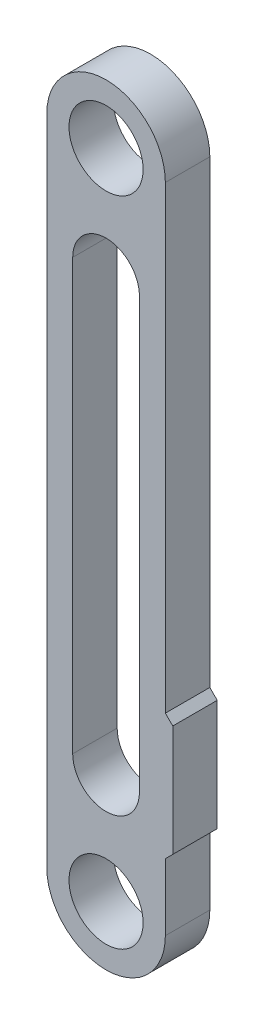
ISO-10303-21;
HEADER;
FILE_DESCRIPTION(('STEP AP214'),'2;1');
FILE_NAME('part.step','',(''),(''),'','','');
FILE_SCHEMA(('AUTOMOTIVE_DESIGN { 1 0 10303 214 1 1 1 1 }'));
ENDSEC;
DATA;
#1=APPLICATION_CONTEXT('core data for automotive mechanical design processes');
#2=APPLICATION_PROTOCOL_DEFINITION('international standard','automotive_design',2000,#1);
#3=PRODUCT_CONTEXT('',#1,'mechanical');
#4=PRODUCT('Part','Part','',(#3));
#5=PRODUCT_RELATED_PRODUCT_CATEGORY('part','',(#4));
#6=PRODUCT_DEFINITION_FORMATION('','',#4);
#7=PRODUCT_DEFINITION_CONTEXT('part definition',#1,'design');
#8=PRODUCT_DEFINITION('design','',#6,#7);
#9=PRODUCT_DEFINITION_SHAPE('','',#8);
#10=(LENGTH_UNIT() NAMED_UNIT(*) SI_UNIT(.MILLI.,.METRE.));
#11=(NAMED_UNIT(*) PLANE_ANGLE_UNIT() SI_UNIT($,.RADIAN.));
#12=(NAMED_UNIT(*) SI_UNIT($,.STERADIAN.) SOLID_ANGLE_UNIT());
#13=UNCERTAINTY_MEASURE_WITH_UNIT(LENGTH_MEASURE(1.E-05),#10,'distance_accuracy_value','');
#14=(GEOMETRIC_REPRESENTATION_CONTEXT(3) GLOBAL_UNCERTAINTY_ASSIGNED_CONTEXT((#13)) GLOBAL_UNIT_ASSIGNED_CONTEXT((#10,
#11,#12)) REPRESENTATION_CONTEXT('',''));
#15=CARTESIAN_POINT('',(0.,0.,0.));
#16=DIRECTION('',(0.,0.,1.));
#17=DIRECTION('',(1.,0.,0.));
#18=AXIS2_PLACEMENT_3D('',#15,#16,#17);
#19=CARTESIAN_POINT('',(8.,0.,6.));
#20=DIRECTION('',(-1.,0.,0.));
#21=DIRECTION('',(0.,0.,1.));
#22=AXIS2_PLACEMENT_3D('',#19,#20,#21);
#23=PLANE('',#22);
#24=DIRECTION('',(0.,1.,0.));
#25=VECTOR('',#24,1.);
#26=CARTESIAN_POINT('',(8.,0.,0.));
#27=LINE('',#26,#25);
#28=CARTESIAN_POINT('',(8.,0.,0.));
#29=VERTEX_POINT('',#28);
#30=CARTESIAN_POINT('',(8.,8.99999999999999,0.));
#31=VERTEX_POINT('',#30);
#32=EDGE_CURVE('E204',#29,#31,#27,.T.);
#33=ORIENTED_EDGE('',*,*,#32,.T.);
#34=DIRECTION('',(0.,0.,1.));
#35=VECTOR('',#34,1.);
#36=CARTESIAN_POINT('',(8.,8.99999999999999,6.));
#37=LINE('',#36,#35);
#38=CARTESIAN_POINT('',(8.,8.99999999999999,6.));
#39=VERTEX_POINT('',#38);
#40=EDGE_CURVE('E221',#31,#39,#37,.T.);
#41=ORIENTED_EDGE('',*,*,#40,.T.);
#42=DIRECTION('',(0.,1.,0.));
#43=VECTOR('',#42,1.);
#44=CARTESIAN_POINT('',(8.,0.,6.));
#45=LINE('',#44,#43);
#46=CARTESIAN_POINT('',(8.,0.,6.));
#47=VERTEX_POINT('',#46);
#48=EDGE_CURVE('E194',#47,#39,#45,.T.);
#49=ORIENTED_EDGE('',*,*,#48,.F.);
#50=DIRECTION('',(0.,0.,-1.));
#51=VECTOR('',#50,1.);
#52=CARTESIAN_POINT('',(8.,0.,6.));
#53=LINE('',#52,#51);
#54=EDGE_CURVE('E218',#47,#29,#53,.T.);
#55=ORIENTED_EDGE('',*,*,#54,.T.);
#56=EDGE_LOOP('',(#33,#41,#49,#55));
#57=FACE_BOUND('',#56,.T.);
#58=ADVANCED_FACE('F38',(#57),#23,.F.);
#59=CARTESIAN_POINT('',(0.,0.,6.));
#60=DIRECTION('',(0.,0.,1.));
#61=DIRECTION('',(1.,0.,0.));
#62=AXIS2_PLACEMENT_3D('',#59,#60,#61);
#63=PLANE('',#62);
#64=CARTESIAN_POINT('',(0.,73.,6.));
#65=DIRECTION('',(0.,0.,1.));
#66=DIRECTION('',(1.,0.,0.));
#67=AXIS2_PLACEMENT_3D('',#64,#65,#66);
#68=CIRCLE('',#67,4.5);
#69=CARTESIAN_POINT('',(4.5,73.,6.));
#70=VERTEX_POINT('',#69);
#71=CARTESIAN_POINT('',(-4.5,73.,6.));
#72=VERTEX_POINT('',#71);
#73=EDGE_CURVE('E175',#70,#72,#68,.T.);
#74=ORIENTED_EDGE('',*,*,#73,.F.);
#75=DIRECTION('',(0.,1.,0.));
#76=VECTOR('',#75,1.);
#77=CARTESIAN_POINT('',(4.49999999999999,0.,6.));
#78=LINE('',#77,#76);
#79=CARTESIAN_POINT('',(4.49999999999999,15.,6.));
#80=VERTEX_POINT('',#79);
#81=EDGE_CURVE('E162',#80,#70,#78,.T.);
#82=ORIENTED_EDGE('',*,*,#81,.F.);
#83=CARTESIAN_POINT('',(0.,15.,6.));
#84=DIRECTION('',(0.,0.,1.));
#85=DIRECTION('',(1.,0.,0.));
#86=AXIS2_PLACEMENT_3D('',#83,#84,#85);
#87=CIRCLE('',#86,4.5);
#88=CARTESIAN_POINT('',(-4.5,15.,6.));
#89=VERTEX_POINT('',#88);
#90=EDGE_CURVE('E170',#89,#80,#87,.T.);
#91=ORIENTED_EDGE('',*,*,#90,.F.);
#92=DIRECTION('',(0.,-1.,0.));
#93=VECTOR('',#92,1.);
#94=CARTESIAN_POINT('',(-4.5,0.,6.));
#95=LINE('',#94,#93);
#96=EDGE_CURVE('E173',#72,#89,#95,.T.);
#97=ORIENTED_EDGE('',*,*,#96,.F.);
#98=EDGE_LOOP('',(#74,#82,#91,#97));
#99=FACE_BOUND('',#98,.T.);
#100=CARTESIAN_POINT('',(0.,88.,6.));
#101=DIRECTION('',(0.,0.,1.));
#102=DIRECTION('',(1.,0.,0.));
#103=AXIS2_PLACEMENT_3D('',#100,#101,#102);
#104=CIRCLE('',#103,5.00000000000001);
#105=CARTESIAN_POINT('',(5.00000000000001,88.,6.));
#106=VERTEX_POINT('',#105);
#107=EDGE_CURVE('E184',#106,#106,#104,.T.);
#108=ORIENTED_EDGE('',*,*,#107,.F.);
#109=EDGE_LOOP('',(#108));
#110=FACE_BOUND('',#109,.T.);
#111=CARTESIAN_POINT('',(0.,0.,6.));
#112=DIRECTION('',(0.,0.,1.));
#113=DIRECTION('',(1.,0.,0.));
#114=AXIS2_PLACEMENT_3D('',#111,#112,#113);
#115=CIRCLE('',#114,8.);
#116=CARTESIAN_POINT('',(-8.,0.,6.));
#117=VERTEX_POINT('',#116);
#118=EDGE_CURVE('E190',#117,#47,#115,.T.);
#119=ORIENTED_EDGE('',*,*,#118,.T.);
#120=ORIENTED_EDGE('',*,*,#48,.T.);
#121=DIRECTION('',(0.707106781186548,0.707106781186548,0.));
#122=VECTOR('',#121,1.);
#123=CARTESIAN_POINT('',(8.,8.99999999999999,6.));
#124=LINE('',#123,#122);
#125=CARTESIAN_POINT('',(9.,9.99999999999999,6.));
#126=VERTEX_POINT('',#125);
#127=EDGE_CURVE('E143',#39,#126,#124,.T.);
#128=ORIENTED_EDGE('',*,*,#127,.T.);
#129=DIRECTION('',(0.,1.,0.));
#130=VECTOR('',#129,1.);
#131=CARTESIAN_POINT('',(9.,9.99999999999999,6.));
#132=LINE('',#131,#130);
#133=CARTESIAN_POINT('',(9.,25.,6.));
#134=VERTEX_POINT('',#133);
#135=EDGE_CURVE('E134',#126,#134,#132,.T.);
#136=ORIENTED_EDGE('',*,*,#135,.T.);
#137=DIRECTION('',(-0.707106781186541,0.707106781186554,0.));
#138=VECTOR('',#137,1.);
#139=CARTESIAN_POINT('',(9.,25.,6.));
#140=LINE('',#139,#138);
#141=CARTESIAN_POINT('',(8.,26.,6.));
#142=VERTEX_POINT('',#141);
#143=EDGE_CURVE('E47',#134,#142,#140,.T.);
#144=ORIENTED_EDGE('',*,*,#143,.T.);
#145=CARTESIAN_POINT('',(8.,88.,6.));
#146=VERTEX_POINT('',#145);
#147=EDGE_CURVE('E192',#142,#146,#45,.T.);
#148=ORIENTED_EDGE('',*,*,#147,.T.);
#149=CARTESIAN_POINT('',(0.,88.,6.));
#150=DIRECTION('',(0.,0.,1.));
#151=DIRECTION('',(1.,0.,0.));
#152=AXIS2_PLACEMENT_3D('',#149,#150,#151);
#153=CIRCLE('',#152,8.);
#154=CARTESIAN_POINT('',(-8.,88.,6.));
#155=VERTEX_POINT('',#154);
#156=EDGE_CURVE('E196',#146,#155,#153,.T.);
#157=ORIENTED_EDGE('',*,*,#156,.T.);
#158=DIRECTION('',(0.,-1.,0.));
#159=VECTOR('',#158,1.);
#160=CARTESIAN_POINT('',(-8.,0.,6.));
#161=LINE('',#160,#159);
#162=EDGE_CURVE('E198',#155,#117,#161,.T.);
#163=ORIENTED_EDGE('',*,*,#162,.T.);
#164=EDGE_LOOP('',(#119,#120,#128,#136,#144,#148,#157,#163));
#165=FACE_BOUND('',#164,.T.);
#166=CARTESIAN_POINT('',(0.,0.,6.));
#167=DIRECTION('',(0.,0.,1.));
#168=DIRECTION('',(1.,0.,0.));
#169=AXIS2_PLACEMENT_3D('',#166,#167,#168);
#170=CIRCLE('',#169,5.);
#171=CARTESIAN_POINT('',(5.,0.,6.));
#172=VERTEX_POINT('',#171);
#173=EDGE_CURVE('E178',#172,#172,#170,.T.);
#174=ORIENTED_EDGE('',*,*,#173,.F.);
#175=EDGE_LOOP('',(#174));
#176=FACE_BOUND('',#175,.T.);
#177=ADVANCED_FACE('F140',(#99,#110,#165,#176),#63,.T.);
#178=CARTESIAN_POINT('',(0.,0.,0.));
#179=DIRECTION('',(0.,0.,1.));
#180=DIRECTION('',(1.,0.,0.));
#181=AXIS2_PLACEMENT_3D('',#178,#179,#180);
#182=PLANE('',#181);
#183=DIRECTION('',(0.,-1.,0.));
#184=VECTOR('',#183,1.);
#185=CARTESIAN_POINT('',(4.5,73.,0.));
#186=LINE('',#185,#184);
#187=CARTESIAN_POINT('',(4.5,73.,0.));
#188=VERTEX_POINT('',#187);
#189=CARTESIAN_POINT('',(4.49999999999999,15.,0.));
#190=VERTEX_POINT('',#189);
#191=EDGE_CURVE('E150',#188,#190,#186,.T.);
#192=ORIENTED_EDGE('',*,*,#191,.F.);
#193=CARTESIAN_POINT('',(0.,73.,0.));
#194=DIRECTION('',(0.,0.,-1.));
#195=DIRECTION('',(-1.,0.,0.));
#196=AXIS2_PLACEMENT_3D('',#193,#194,#195);
#197=CIRCLE('',#196,4.5);
#198=CARTESIAN_POINT('',(-4.5,73.,0.));
#199=VERTEX_POINT('',#198);
#200=EDGE_CURVE('E148',#199,#188,#197,.T.);
#201=ORIENTED_EDGE('',*,*,#200,.F.);
#202=DIRECTION('',(0.,1.,0.));
#203=VECTOR('',#202,1.);
#204=CARTESIAN_POINT('',(-4.5,73.,0.));
#205=LINE('',#204,#203);
#206=CARTESIAN_POINT('',(-4.5,15.,0.));
#207=VERTEX_POINT('',#206);
#208=EDGE_CURVE('E156',#207,#199,#205,.T.);
#209=ORIENTED_EDGE('',*,*,#208,.F.);
#210=CARTESIAN_POINT('',(0.,15.,0.));
#211=DIRECTION('',(0.,0.,-1.));
#212=DIRECTION('',(-1.,0.,0.));
#213=AXIS2_PLACEMENT_3D('',#210,#211,#212);
#214=CIRCLE('',#213,4.5);
#215=EDGE_CURVE('E153',#190,#207,#214,.T.);
#216=ORIENTED_EDGE('',*,*,#215,.F.);
#217=EDGE_LOOP('',(#192,#201,#209,#216));
#218=FACE_BOUND('',#217,.T.);
#219=CARTESIAN_POINT('',(0.,0.,0.));
#220=DIRECTION('',(0.,0.,1.));
#221=DIRECTION('',(1.,0.,0.));
#222=AXIS2_PLACEMENT_3D('',#219,#220,#221);
#223=CIRCLE('',#222,8.);
#224=CARTESIAN_POINT('',(-8.,0.,0.));
#225=VERTEX_POINT('',#224);
#226=EDGE_CURVE('E187',#225,#29,#223,.T.);
#227=ORIENTED_EDGE('',*,*,#226,.F.);
#228=DIRECTION('',(0.,-1.,0.));
#229=VECTOR('',#228,1.);
#230=CARTESIAN_POINT('',(-8.,0.,0.));
#231=LINE('',#230,#229);
#232=CARTESIAN_POINT('',(-8.,88.,0.));
#233=VERTEX_POINT('',#232);
#234=EDGE_CURVE('E193',#233,#225,#231,.T.);
#235=ORIENTED_EDGE('',*,*,#234,.F.);
#236=CARTESIAN_POINT('',(0.,88.,0.));
#237=DIRECTION('',(0.,0.,1.));
#238=DIRECTION('',(1.,0.,0.));
#239=AXIS2_PLACEMENT_3D('',#236,#237,#238);
#240=CIRCLE('',#239,8.);
#241=CARTESIAN_POINT('',(8.,88.,0.));
#242=VERTEX_POINT('',#241);
#243=EDGE_CURVE('E207',#242,#233,#240,.T.);
#244=ORIENTED_EDGE('',*,*,#243,.F.);
#245=CARTESIAN_POINT('',(8.,26.,0.));
#246=VERTEX_POINT('',#245);
#247=EDGE_CURVE('E203',#246,#242,#27,.T.);
#248=ORIENTED_EDGE('',*,*,#247,.F.);
#249=DIRECTION('',(0.707106781186541,-0.707106781186554,0.));
#250=VECTOR('',#249,1.);
#251=CARTESIAN_POINT('',(17.0000000000001,16.9999999999998,0.));
#252=LINE('',#251,#250);
#253=CARTESIAN_POINT('',(9.,25.,0.));
#254=VERTEX_POINT('',#253);
#255=EDGE_CURVE('E11',#246,#254,#252,.T.);
#256=ORIENTED_EDGE('',*,*,#255,.T.);
#257=DIRECTION('',(0.,-1.,0.));
#258=VECTOR('',#257,1.);
#259=CARTESIAN_POINT('',(9.,9.99999999999999,0.));
#260=LINE('',#259,#258);
#261=CARTESIAN_POINT('',(9.,9.99999999999999,0.));
#262=VERTEX_POINT('',#261);
#263=EDGE_CURVE('E136',#254,#262,#260,.T.);
#264=ORIENTED_EDGE('',*,*,#263,.T.);
#265=DIRECTION('',(-0.707106781186548,-0.707106781186548,0.));
#266=VECTOR('',#265,1.);
#267=CARTESIAN_POINT('',(-0.499999999999993,0.5,0.));
#268=LINE('',#267,#266);
#269=EDGE_CURVE('E128',#262,#31,#268,.T.);
#270=ORIENTED_EDGE('',*,*,#269,.T.);
#271=ORIENTED_EDGE('',*,*,#32,.F.);
#272=EDGE_LOOP('',(#227,#235,#244,#248,#256,#264,#270,#271));
#273=FACE_BOUND('',#272,.T.);
#274=CARTESIAN_POINT('',(0.,88.,0.));
#275=DIRECTION('',(0.,0.,1.));
#276=DIRECTION('',(1.,0.,0.));
#277=AXIS2_PLACEMENT_3D('',#274,#275,#276);
#278=CIRCLE('',#277,5.00000000000001);
#279=CARTESIAN_POINT('',(5.00000000000001,88.,0.));
#280=VERTEX_POINT('',#279);
#281=EDGE_CURVE('E181',#280,#280,#278,.T.);
#282=ORIENTED_EDGE('',*,*,#281,.T.);
#283=EDGE_LOOP('',(#282));
#284=FACE_BOUND('',#283,.T.);
#285=CARTESIAN_POINT('',(0.,0.,0.));
#286=DIRECTION('',(0.,0.,1.));
#287=DIRECTION('',(1.,0.,0.));
#288=AXIS2_PLACEMENT_3D('',#285,#286,#287);
#289=CIRCLE('',#288,5.);
#290=CARTESIAN_POINT('',(5.,0.,0.));
#291=VERTEX_POINT('',#290);
#292=EDGE_CURVE('E177',#291,#291,#289,.T.);
#293=ORIENTED_EDGE('',*,*,#292,.T.);
#294=EDGE_LOOP('',(#293));
#295=FACE_BOUND('',#294,.T.);
#296=ADVANCED_FACE('F229',(#218,#273,#284,#295),#182,.F.);
#297=CARTESIAN_POINT('',(0.,0.,6.));
#298=DIRECTION('',(0.,0.,-1.));
#299=DIRECTION('',(-1.,0.,0.));
#300=AXIS2_PLACEMENT_3D('',#297,#298,#299);
#301=CYLINDRICAL_SURFACE('',#300,8.);
#302=ORIENTED_EDGE('',*,*,#226,.T.);
#303=ORIENTED_EDGE('',*,*,#54,.F.);
#304=ORIENTED_EDGE('',*,*,#118,.F.);
#305=DIRECTION('',(0.,0.,-1.));
#306=VECTOR('',#305,1.);
#307=CARTESIAN_POINT('',(-8.,0.,6.));
#308=LINE('',#307,#306);
#309=EDGE_CURVE('E200',#117,#225,#308,.T.);
#310=ORIENTED_EDGE('',*,*,#309,.T.);
#311=EDGE_LOOP('',(#302,#303,#304,#310));
#312=FACE_BOUND('',#311,.T.);
#313=ADVANCED_FACE('F256',(#312),#301,.T.);
#314=ORIENTED_EDGE('',*,*,#147,.F.);
#315=DIRECTION('',(0.,0.,-1.));
#316=VECTOR('',#315,1.);
#317=CARTESIAN_POINT('',(8.,26.,6.));
#318=LINE('',#317,#316);
#319=EDGE_CURVE('E54',#142,#246,#318,.T.);
#320=ORIENTED_EDGE('',*,*,#319,.T.);
#321=ORIENTED_EDGE('',*,*,#247,.T.);
#322=DIRECTION('',(0.,0.,-1.));
#323=VECTOR('',#322,1.);
#324=CARTESIAN_POINT('',(8.,88.,6.));
#325=LINE('',#324,#323);
#326=EDGE_CURVE('E215',#146,#242,#325,.T.);
#327=ORIENTED_EDGE('',*,*,#326,.F.);
#328=EDGE_LOOP('',(#314,#320,#321,#327));
#329=FACE_BOUND('',#328,.T.);
#330=ADVANCED_FACE('F247',(#329),#23,.F.);
#331=CARTESIAN_POINT('',(0.,88.,6.));
#332=DIRECTION('',(0.,0.,-1.));
#333=DIRECTION('',(-1.,0.,0.));
#334=AXIS2_PLACEMENT_3D('',#331,#332,#333);
#335=CYLINDRICAL_SURFACE('',#334,8.);
#336=ORIENTED_EDGE('',*,*,#243,.T.);
#337=DIRECTION('',(0.,0.,-1.));
#338=VECTOR('',#337,1.);
#339=CARTESIAN_POINT('',(-8.,88.,6.));
#340=LINE('',#339,#338);
#341=EDGE_CURVE('E212',#155,#233,#340,.T.);
#342=ORIENTED_EDGE('',*,*,#341,.F.);
#343=ORIENTED_EDGE('',*,*,#156,.F.);
#344=ORIENTED_EDGE('',*,*,#326,.T.);
#345=EDGE_LOOP('',(#336,#342,#343,#344));
#346=FACE_BOUND('',#345,.T.);
#347=ADVANCED_FACE('F255',(#346),#335,.T.);
#348=CARTESIAN_POINT('',(-8.,0.,6.));
#349=DIRECTION('',(1.,0.,0.));
#350=DIRECTION('',(0.,0.,-1.));
#351=AXIS2_PLACEMENT_3D('',#348,#349,#350);
#352=PLANE('',#351);
#353=ORIENTED_EDGE('',*,*,#234,.T.);
#354=ORIENTED_EDGE('',*,*,#309,.F.);
#355=ORIENTED_EDGE('',*,*,#162,.F.);
#356=ORIENTED_EDGE('',*,*,#341,.T.);
#357=EDGE_LOOP('',(#353,#354,#355,#356));
#358=FACE_BOUND('',#357,.T.);
#359=ADVANCED_FACE('F261',(#358),#352,.F.);
#360=CARTESIAN_POINT('',(0.,88.,6.));
#361=DIRECTION('',(0.,0.,-1.));
#362=DIRECTION('',(-1.,0.,0.));
#363=AXIS2_PLACEMENT_3D('',#360,#361,#362);
#364=CYLINDRICAL_SURFACE('',#363,5.00000000000001);
#365=ORIENTED_EDGE('',*,*,#107,.T.);
#366=EDGE_LOOP('',(#365));
#367=FACE_BOUND('',#366,.T.);
#368=ORIENTED_EDGE('',*,*,#281,.F.);
#369=EDGE_LOOP('',(#368));
#370=FACE_BOUND('',#369,.T.);
#371=ADVANCED_FACE('F274',(#367,#370),#364,.F.);
#372=CARTESIAN_POINT('',(0.,0.,6.));
#373=DIRECTION('',(0.,0.,-1.));
#374=DIRECTION('',(-1.,0.,0.));
#375=AXIS2_PLACEMENT_3D('',#372,#373,#374);
#376=CYLINDRICAL_SURFACE('',#375,5.);
#377=ORIENTED_EDGE('',*,*,#173,.T.);
#378=EDGE_LOOP('',(#377));
#379=FACE_BOUND('',#378,.T.);
#380=ORIENTED_EDGE('',*,*,#292,.F.);
#381=EDGE_LOOP('',(#380));
#382=FACE_BOUND('',#381,.T.);
#383=ADVANCED_FACE('F279',(#379,#382),#376,.F.);
#384=CARTESIAN_POINT('',(0.,73.,10.));
#385=DIRECTION('',(0.,0.,-1.));
#386=DIRECTION('',(-1.,0.,0.));
#387=AXIS2_PLACEMENT_3D('',#384,#385,#386);
#388=CYLINDRICAL_SURFACE('',#387,4.5);
#389=ORIENTED_EDGE('',*,*,#73,.T.);
#390=DIRECTION('',(0.,0.,-1.));
#391=VECTOR('',#390,1.);
#392=CARTESIAN_POINT('',(-4.5,73.,10.));
#393=LINE('',#392,#391);
#394=EDGE_CURVE('E160',#72,#199,#393,.T.);
#395=ORIENTED_EDGE('',*,*,#394,.T.);
#396=ORIENTED_EDGE('',*,*,#200,.T.);
#397=DIRECTION('',(0.,0.,-1.));
#398=VECTOR('',#397,1.);
#399=CARTESIAN_POINT('',(4.5,73.,10.));
#400=LINE('',#399,#398);
#401=EDGE_CURVE('E159',#70,#188,#400,.T.);
#402=ORIENTED_EDGE('',*,*,#401,.F.);
#403=EDGE_LOOP('',(#389,#395,#396,#402));
#404=FACE_BOUND('',#403,.T.);
#405=ADVANCED_FACE('F288',(#404),#388,.F.);
#406=CARTESIAN_POINT('',(-4.5,73.,10.));
#407=DIRECTION('',(-1.,0.,0.));
#408=DIRECTION('',(0.,0.,1.));
#409=AXIS2_PLACEMENT_3D('',#406,#407,#408);
#410=PLANE('',#409);
#411=ORIENTED_EDGE('',*,*,#96,.T.);
#412=DIRECTION('',(0.,0.,-1.));
#413=VECTOR('',#412,1.);
#414=CARTESIAN_POINT('',(-4.5,15.,10.));
#415=LINE('',#414,#413);
#416=EDGE_CURVE('E163',#89,#207,#415,.T.);
#417=ORIENTED_EDGE('',*,*,#416,.T.);
#418=ORIENTED_EDGE('',*,*,#208,.T.);
#419=ORIENTED_EDGE('',*,*,#394,.F.);
#420=EDGE_LOOP('',(#411,#417,#418,#419));
#421=FACE_BOUND('',#420,.T.);
#422=ADVANCED_FACE('F292',(#421),#410,.F.);
#423=CARTESIAN_POINT('',(0.,15.,10.));
#424=DIRECTION('',(0.,0.,-1.));
#425=DIRECTION('',(-1.,0.,0.));
#426=AXIS2_PLACEMENT_3D('',#423,#424,#425);
#427=CYLINDRICAL_SURFACE('',#426,4.5);
#428=ORIENTED_EDGE('',*,*,#90,.T.);
#429=DIRECTION('',(0.,0.,-1.));
#430=VECTOR('',#429,1.);
#431=CARTESIAN_POINT('',(4.49999999999999,15.,10.));
#432=LINE('',#431,#430);
#433=EDGE_CURVE('E165',#80,#190,#432,.T.);
#434=ORIENTED_EDGE('',*,*,#433,.T.);
#435=ORIENTED_EDGE('',*,*,#215,.T.);
#436=ORIENTED_EDGE('',*,*,#416,.F.);
#437=EDGE_LOOP('',(#428,#434,#435,#436));
#438=FACE_BOUND('',#437,.T.);
#439=ADVANCED_FACE('F296',(#438),#427,.F.);
#440=CARTESIAN_POINT('',(4.5,73.,10.));
#441=DIRECTION('',(1.,0.,0.));
#442=DIRECTION('',(0.,1.,0.));
#443=AXIS2_PLACEMENT_3D('',#440,#441,#442);
#444=PLANE('',#443);
#445=ORIENTED_EDGE('',*,*,#81,.T.);
#446=ORIENTED_EDGE('',*,*,#401,.T.);
#447=ORIENTED_EDGE('',*,*,#191,.T.);
#448=ORIENTED_EDGE('',*,*,#433,.F.);
#449=EDGE_LOOP('',(#445,#446,#447,#448));
#450=FACE_BOUND('',#449,.T.);
#451=ADVANCED_FACE('F241',(#450),#444,.F.);
#452=CARTESIAN_POINT('',(9.,9.99999999999999,-15.0332963783729));
#453=DIRECTION('',(1.,0.,0.));
#454=DIRECTION('',(0.,0.,-1.));
#455=AXIS2_PLACEMENT_3D('',#452,#453,#454);
#456=PLANE('',#455);
#457=ORIENTED_EDGE('',*,*,#263,.F.);
#458=DIRECTION('',(0.,0.,1.));
#459=VECTOR('',#458,1.);
#460=CARTESIAN_POINT('',(9.,25.,-15.0332963783729));
#461=LINE('',#460,#459);
#462=EDGE_CURVE('E127',#254,#134,#461,.T.);
#463=ORIENTED_EDGE('',*,*,#462,.T.);
#464=ORIENTED_EDGE('',*,*,#135,.F.);
#465=DIRECTION('',(0.,0.,1.));
#466=VECTOR('',#465,1.);
#467=CARTESIAN_POINT('',(9.,9.99999999999999,-15.0332963783729));
#468=LINE('',#467,#466);
#469=EDGE_CURVE('E137',#262,#126,#468,.T.);
#470=ORIENTED_EDGE('',*,*,#469,.F.);
#471=EDGE_LOOP('',(#457,#463,#464,#470));
#472=FACE_BOUND('',#471,.T.);
#473=ADVANCED_FACE('F132',(#472),#456,.T.);
#474=CARTESIAN_POINT('',(8.,8.99999999999999,6.));
#475=DIRECTION('',(-0.707106781186547,0.707106781186547,0.));
#476=DIRECTION('',(0.,0.,1.));
#477=AXIS2_PLACEMENT_3D('',#474,#475,#476);
#478=PLANE('',#477);
#479=ORIENTED_EDGE('',*,*,#269,.F.);
#480=ORIENTED_EDGE('',*,*,#469,.T.);
#481=ORIENTED_EDGE('',*,*,#127,.F.);
#482=ORIENTED_EDGE('',*,*,#40,.F.);
#483=EDGE_LOOP('',(#479,#480,#481,#482));
#484=FACE_BOUND('',#483,.T.);
#485=ADVANCED_FACE('F235',(#484),#478,.F.);
#486=CARTESIAN_POINT('',(9.,25.,-15.0332963783729));
#487=DIRECTION('',(-0.707106781186554,-0.707106781186541,0.));
#488=DIRECTION('',(0.,0.,1.));
#489=AXIS2_PLACEMENT_3D('',#486,#487,#488);
#490=PLANE('',#489);
#491=ORIENTED_EDGE('',*,*,#255,.F.);
#492=ORIENTED_EDGE('',*,*,#319,.F.);
#493=ORIENTED_EDGE('',*,*,#143,.F.);
#494=ORIENTED_EDGE('',*,*,#462,.F.);
#495=EDGE_LOOP('',(#491,#492,#493,#494));
#496=FACE_BOUND('',#495,.T.);
#497=ADVANCED_FACE('F41',(#496),#490,.F.);
#498=CLOSED_SHELL('',(#58,#177,#296,#313,#330,#347,#359,#371,#383,#405,#422,#439,#451,#473,#485,#497));
#499=MANIFOLD_SOLID_BREP('B2',#498);
#500=ADVANCED_BREP_SHAPE_REPRESENTATION('',(#18,#499),#14);
#501=SHAPE_DEFINITION_REPRESENTATION(#9,#500);
ENDSEC;
END-ISO-10303-21;
